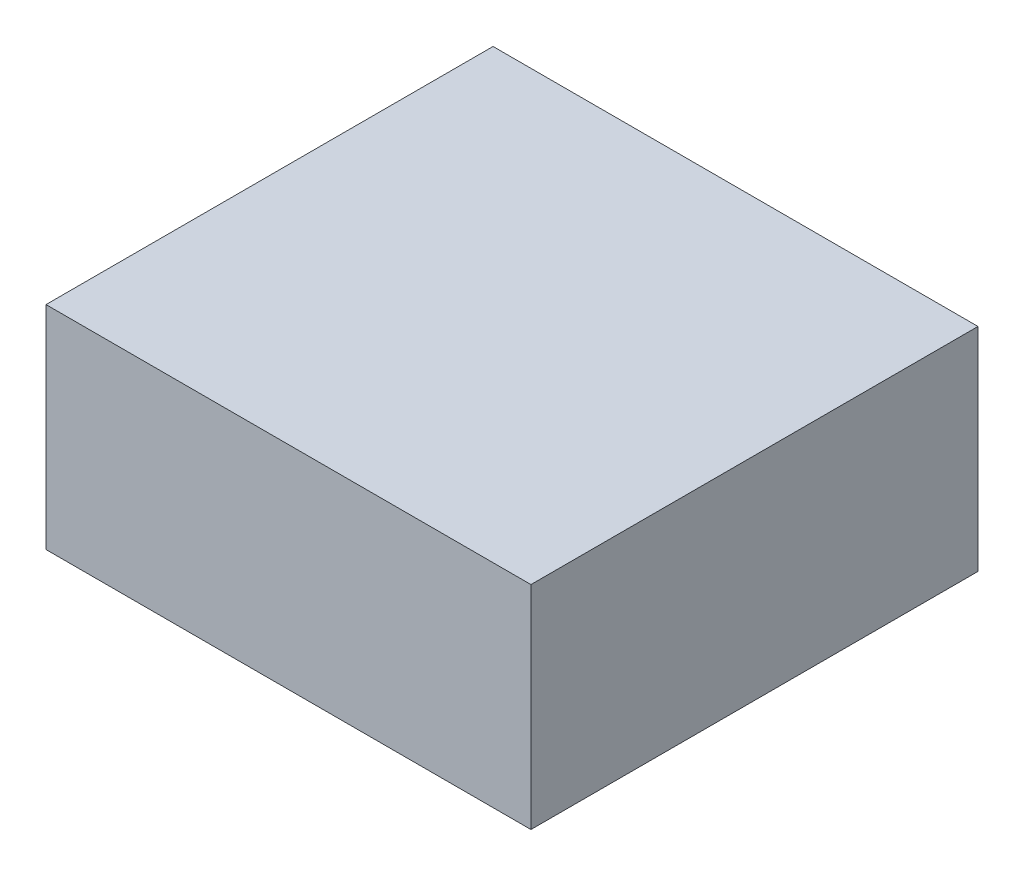
ISO-10303-21;
HEADER;
FILE_DESCRIPTION(('STEP AP214'),'2;1');
FILE_NAME('part.step','',(''),(''),'','','');
FILE_SCHEMA(('AUTOMOTIVE_DESIGN { 1 0 10303 214 1 1 1 1 }'));
ENDSEC;
DATA;
#1=APPLICATION_CONTEXT('core data for automotive mechanical design processes');
#2=APPLICATION_PROTOCOL_DEFINITION('international standard','automotive_design',2000,#1);
#3=PRODUCT_CONTEXT('',#1,'mechanical');
#4=PRODUCT('Part','Part','',(#3));
#5=PRODUCT_RELATED_PRODUCT_CATEGORY('part','',(#4));
#6=PRODUCT_DEFINITION_FORMATION('','',#4);
#7=PRODUCT_DEFINITION_CONTEXT('part definition',#1,'design');
#8=PRODUCT_DEFINITION('design','',#6,#7);
#9=PRODUCT_DEFINITION_SHAPE('','',#8);
#10=(LENGTH_UNIT() NAMED_UNIT(*) SI_UNIT(.MILLI.,.METRE.));
#11=(NAMED_UNIT(*) PLANE_ANGLE_UNIT() SI_UNIT($,.RADIAN.));
#12=(NAMED_UNIT(*) SI_UNIT($,.STERADIAN.) SOLID_ANGLE_UNIT());
#13=UNCERTAINTY_MEASURE_WITH_UNIT(LENGTH_MEASURE(1.E-05),#10,'distance_accuracy_value','');
#14=(GEOMETRIC_REPRESENTATION_CONTEXT(3) GLOBAL_UNCERTAINTY_ASSIGNED_CONTEXT((#13)) GLOBAL_UNIT_ASSIGNED_CONTEXT((#10,
#11,#12)) REPRESENTATION_CONTEXT('',''));
#15=CARTESIAN_POINT('',(0.,0.,0.));
#16=DIRECTION('',(0.,0.,1.));
#17=DIRECTION('',(1.,0.,0.));
#18=AXIS2_PLACEMENT_3D('',#15,#16,#17);
#19=CARTESIAN_POINT('',(0.,28.,0.));
#20=DIRECTION('',(1.,0.,0.));
#21=DIRECTION('',(0.,0.,-1.));
#22=AXIS2_PLACEMENT_3D('',#19,#20,#21);
#23=PLANE('',#22);
#24=DIRECTION('',(0.,0.,1.));
#25=VECTOR('',#24,1.);
#26=CARTESIAN_POINT('',(0.,0.,0.));
#27=LINE('',#26,#25);
#28=CARTESIAN_POINT('',(0.,0.,-59.));
#29=VERTEX_POINT('',#28);
#30=CARTESIAN_POINT('',(0.,0.,0.));
#31=VERTEX_POINT('',#30);
#32=EDGE_CURVE('E113',#29,#31,#27,.T.);
#33=ORIENTED_EDGE('',*,*,#32,.T.);
#34=DIRECTION('',(0.,-1.,0.));
#35=VECTOR('',#34,1.);
#36=CARTESIAN_POINT('',(0.,28.,0.));
#37=LINE('',#36,#35);
#38=CARTESIAN_POINT('',(0.,28.,0.));
#39=VERTEX_POINT('',#38);
#40=EDGE_CURVE('E11',#39,#31,#37,.T.);
#41=ORIENTED_EDGE('',*,*,#40,.F.);
#42=DIRECTION('',(0.,0.,1.));
#43=VECTOR('',#42,1.);
#44=CARTESIAN_POINT('',(0.,28.,0.));
#45=LINE('',#44,#43);
#46=CARTESIAN_POINT('',(0.,28.,-59.));
#47=VERTEX_POINT('',#46);
#48=EDGE_CURVE('E97',#47,#39,#45,.T.);
#49=ORIENTED_EDGE('',*,*,#48,.F.);
#50=DIRECTION('',(0.,-1.,0.));
#51=VECTOR('',#50,1.);
#52=CARTESIAN_POINT('',(0.,28.,-59.));
#53=LINE('',#52,#51);
#54=EDGE_CURVE('E109',#47,#29,#53,.T.);
#55=ORIENTED_EDGE('',*,*,#54,.T.);
#56=EDGE_LOOP('',(#33,#41,#49,#55));
#57=FACE_BOUND('',#56,.T.);
#58=ADVANCED_FACE('F45',(#57),#23,.F.);
#59=CARTESIAN_POINT('',(0.,28.,0.));
#60=DIRECTION('',(0.,0.,-1.));
#61=DIRECTION('',(-1.,0.,0.));
#62=AXIS2_PLACEMENT_3D('',#59,#60,#61);
#63=PLANE('',#62);
#64=DIRECTION('',(1.,0.,0.));
#65=VECTOR('',#64,1.);
#66=CARTESIAN_POINT('',(0.,0.,0.));
#67=LINE('',#66,#65);
#68=CARTESIAN_POINT('',(64.,0.,0.));
#69=VERTEX_POINT('',#68);
#70=EDGE_CURVE('E102',#31,#69,#67,.T.);
#71=ORIENTED_EDGE('',*,*,#70,.T.);
#72=DIRECTION('',(0.,-1.,0.));
#73=VECTOR('',#72,1.);
#74=CARTESIAN_POINT('',(64.,28.,0.));
#75=LINE('',#74,#73);
#76=CARTESIAN_POINT('',(64.,28.,0.));
#77=VERTEX_POINT('',#76);
#78=EDGE_CURVE('E54',#77,#69,#75,.T.);
#79=ORIENTED_EDGE('',*,*,#78,.F.);
#80=DIRECTION('',(1.,0.,0.));
#81=VECTOR('',#80,1.);
#82=CARTESIAN_POINT('',(0.,28.,0.));
#83=LINE('',#82,#81);
#84=EDGE_CURVE('E92',#39,#77,#83,.T.);
#85=ORIENTED_EDGE('',*,*,#84,.F.);
#86=ORIENTED_EDGE('',*,*,#40,.T.);
#87=EDGE_LOOP('',(#71,#79,#85,#86));
#88=FACE_BOUND('',#87,.T.);
#89=ADVANCED_FACE('F101',(#88),#63,.F.);
#90=CARTESIAN_POINT('',(64.,28.,0.));
#91=DIRECTION('',(-1.,0.,0.));
#92=DIRECTION('',(0.,0.,1.));
#93=AXIS2_PLACEMENT_3D('',#90,#91,#92);
#94=PLANE('',#93);
#95=DIRECTION('',(0.,0.,-1.));
#96=VECTOR('',#95,1.);
#97=CARTESIAN_POINT('',(64.,0.,0.));
#98=LINE('',#97,#96);
#99=CARTESIAN_POINT('',(64.,0.,-59.));
#100=VERTEX_POINT('',#99);
#101=EDGE_CURVE('E79',#69,#100,#98,.T.);
#102=ORIENTED_EDGE('',*,*,#101,.T.);
#103=DIRECTION('',(0.,-1.,0.));
#104=VECTOR('',#103,1.);
#105=CARTESIAN_POINT('',(64.,28.,-59.));
#106=LINE('',#105,#104);
#107=CARTESIAN_POINT('',(64.,28.,-59.));
#108=VERTEX_POINT('',#107);
#109=EDGE_CURVE('E104',#108,#100,#106,.T.);
#110=ORIENTED_EDGE('',*,*,#109,.F.);
#111=DIRECTION('',(0.,0.,-1.));
#112=VECTOR('',#111,1.);
#113=CARTESIAN_POINT('',(64.,28.,0.));
#114=LINE('',#113,#112);
#115=EDGE_CURVE('E95',#77,#108,#114,.T.);
#116=ORIENTED_EDGE('',*,*,#115,.F.);
#117=ORIENTED_EDGE('',*,*,#78,.T.);
#118=EDGE_LOOP('',(#102,#110,#116,#117));
#119=FACE_BOUND('',#118,.T.);
#120=ADVANCED_FACE('F105',(#119),#94,.F.);
#121=CARTESIAN_POINT('',(0.,28.,-59.));
#122=DIRECTION('',(0.,0.,1.));
#123=DIRECTION('',(1.,0.,0.));
#124=AXIS2_PLACEMENT_3D('',#121,#122,#123);
#125=PLANE('',#124);
#126=DIRECTION('',(-1.,0.,0.));
#127=VECTOR('',#126,1.);
#128=CARTESIAN_POINT('',(0.,0.,-59.));
#129=LINE('',#128,#127);
#130=EDGE_CURVE('E85',#100,#29,#129,.T.);
#131=ORIENTED_EDGE('',*,*,#130,.T.);
#132=ORIENTED_EDGE('',*,*,#54,.F.);
#133=DIRECTION('',(-1.,0.,0.));
#134=VECTOR('',#133,1.);
#135=CARTESIAN_POINT('',(0.,28.,-59.));
#136=LINE('',#135,#134);
#137=EDGE_CURVE('E62',#108,#47,#136,.T.);
#138=ORIENTED_EDGE('',*,*,#137,.F.);
#139=ORIENTED_EDGE('',*,*,#109,.T.);
#140=EDGE_LOOP('',(#131,#132,#138,#139));
#141=FACE_BOUND('',#140,.T.);
#142=ADVANCED_FACE('F126',(#141),#125,.F.);
#143=CARTESIAN_POINT('',(0.,28.,0.));
#144=DIRECTION('',(0.,-1.,0.));
#145=DIRECTION('',(0.,0.,-1.));
#146=AXIS2_PLACEMENT_3D('',#143,#144,#145);
#147=PLANE('',#146);
#148=ORIENTED_EDGE('',*,*,#48,.T.);
#149=ORIENTED_EDGE('',*,*,#84,.T.);
#150=ORIENTED_EDGE('',*,*,#115,.T.);
#151=ORIENTED_EDGE('',*,*,#137,.T.);
#152=EDGE_LOOP('',(#148,#149,#150,#151));
#153=FACE_BOUND('',#152,.T.);
#154=ADVANCED_FACE('F93',(#153),#147,.F.);
#155=CARTESIAN_POINT('',(0.,0.,0.));
#156=DIRECTION('',(0.,-1.,0.));
#157=DIRECTION('',(0.,0.,-1.));
#158=AXIS2_PLACEMENT_3D('',#155,#156,#157);
#159=PLANE('',#158);
#160=ORIENTED_EDGE('',*,*,#32,.F.);
#161=ORIENTED_EDGE('',*,*,#130,.F.);
#162=ORIENTED_EDGE('',*,*,#101,.F.);
#163=ORIENTED_EDGE('',*,*,#70,.F.);
#164=EDGE_LOOP('',(#160,#161,#162,#163));
#165=FACE_BOUND('',#164,.T.);
#166=ADVANCED_FACE('F129',(#165),#159,.T.);
#167=CLOSED_SHELL('',(#58,#89,#120,#142,#154,#166));
#168=MANIFOLD_SOLID_BREP('B2',#167);
#169=ADVANCED_BREP_SHAPE_REPRESENTATION('',(#18,#168),#14);
#170=SHAPE_DEFINITION_REPRESENTATION(#9,#169);
ENDSEC;
END-ISO-10303-21;
